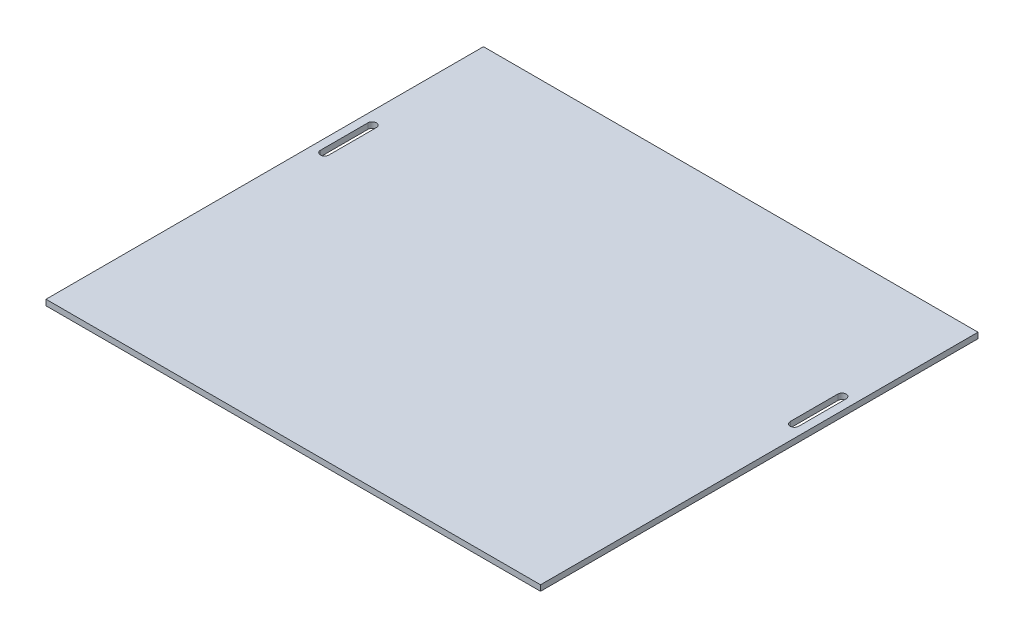
ISO-10303-21;
HEADER;
FILE_DESCRIPTION(('STEP AP214'),'2;1');
FILE_NAME('part.step','',(''),(''),'','','');
FILE_SCHEMA(('AUTOMOTIVE_DESIGN { 1 0 10303 214 1 1 1 1 }'));
ENDSEC;
DATA;
#1=APPLICATION_CONTEXT('core data for automotive mechanical design processes');
#2=APPLICATION_PROTOCOL_DEFINITION('international standard','automotive_design',2000,#1);
#3=PRODUCT_CONTEXT('',#1,'mechanical');
#4=PRODUCT('Part','Part','',(#3));
#5=PRODUCT_RELATED_PRODUCT_CATEGORY('part','',(#4));
#6=PRODUCT_DEFINITION_FORMATION('','',#4);
#7=PRODUCT_DEFINITION_CONTEXT('part definition',#1,'design');
#8=PRODUCT_DEFINITION('design','',#6,#7);
#9=PRODUCT_DEFINITION_SHAPE('','',#8);
#10=(LENGTH_UNIT() NAMED_UNIT(*) SI_UNIT(.MILLI.,.METRE.));
#11=(NAMED_UNIT(*) PLANE_ANGLE_UNIT() SI_UNIT($,.RADIAN.));
#12=(NAMED_UNIT(*) SI_UNIT($,.STERADIAN.) SOLID_ANGLE_UNIT());
#13=UNCERTAINTY_MEASURE_WITH_UNIT(LENGTH_MEASURE(1.E-05),#10,'distance_accuracy_value','');
#14=(GEOMETRIC_REPRESENTATION_CONTEXT(3) GLOBAL_UNCERTAINTY_ASSIGNED_CONTEXT((#13)) GLOBAL_UNIT_ASSIGNED_CONTEXT((#10,
#11,#12)) REPRESENTATION_CONTEXT('',''));
#15=CARTESIAN_POINT('',(0.,0.,0.));
#16=DIRECTION('',(0.,0.,1.));
#17=DIRECTION('',(1.,0.,0.));
#18=AXIS2_PLACEMENT_3D('',#15,#16,#17);
#19=CARTESIAN_POINT('',(260.,3.,0.));
#20=DIRECTION('',(0.,0.,1.));
#21=DIRECTION('',(1.,0.,0.));
#22=AXIS2_PLACEMENT_3D('',#19,#20,#21);
#23=PLANE('',#22);
#24=DIRECTION('',(-1.,0.,0.));
#25=VECTOR('',#24,1.);
#26=CARTESIAN_POINT('',(260.,0.,0.));
#27=LINE('',#26,#25);
#28=CARTESIAN_POINT('',(260.,0.,0.));
#29=VERTEX_POINT('',#28);
#30=CARTESIAN_POINT('',(0.,0.,0.));
#31=VERTEX_POINT('',#30);
#32=EDGE_CURVE('E164',#29,#31,#27,.T.);
#33=ORIENTED_EDGE('',*,*,#32,.T.);
#34=DIRECTION('',(0.,-1.,0.));
#35=VECTOR('',#34,1.);
#36=CARTESIAN_POINT('',(0.,3.,0.));
#37=LINE('',#36,#35);
#38=CARTESIAN_POINT('',(0.,3.,0.));
#39=VERTEX_POINT('',#38);
#40=EDGE_CURVE('E11',#39,#31,#37,.T.);
#41=ORIENTED_EDGE('',*,*,#40,.F.);
#42=DIRECTION('',(-1.,0.,0.));
#43=VECTOR('',#42,1.);
#44=CARTESIAN_POINT('',(260.,3.,0.));
#45=LINE('',#44,#43);
#46=CARTESIAN_POINT('',(260.,3.,0.));
#47=VERTEX_POINT('',#46);
#48=EDGE_CURVE('E197',#47,#39,#45,.T.);
#49=ORIENTED_EDGE('',*,*,#48,.F.);
#50=DIRECTION('',(0.,-1.,0.));
#51=VECTOR('',#50,1.);
#52=CARTESIAN_POINT('',(260.,3.,0.));
#53=LINE('',#52,#51);
#54=EDGE_CURVE('E207',#47,#29,#53,.T.);
#55=ORIENTED_EDGE('',*,*,#54,.T.);
#56=EDGE_LOOP('',(#33,#41,#49,#55));
#57=FACE_BOUND('',#56,.T.);
#58=ADVANCED_FACE('F39',(#57),#23,.F.);
#59=CARTESIAN_POINT('',(0.,3.,0.));
#60=DIRECTION('',(1.,0.,0.));
#61=DIRECTION('',(0.,0.,-1.));
#62=AXIS2_PLACEMENT_3D('',#59,#60,#61);
#63=PLANE('',#62);
#64=DIRECTION('',(0.,0.,1.));
#65=VECTOR('',#64,1.);
#66=CARTESIAN_POINT('',(0.,0.,0.));
#67=LINE('',#66,#65);
#68=CARTESIAN_POINT('',(0.,0.,230.));
#69=VERTEX_POINT('',#68);
#70=EDGE_CURVE('E210',#31,#69,#67,.T.);
#71=ORIENTED_EDGE('',*,*,#70,.T.);
#72=DIRECTION('',(0.,-1.,0.));
#73=VECTOR('',#72,1.);
#74=CARTESIAN_POINT('',(0.,3.,230.));
#75=LINE('',#74,#73);
#76=CARTESIAN_POINT('',(0.,3.,230.));
#77=VERTEX_POINT('',#76);
#78=EDGE_CURVE('E46',#77,#69,#75,.T.);
#79=ORIENTED_EDGE('',*,*,#78,.F.);
#80=DIRECTION('',(0.,0.,1.));
#81=VECTOR('',#80,1.);
#82=CARTESIAN_POINT('',(0.,3.,0.));
#83=LINE('',#82,#81);
#84=EDGE_CURVE('E200',#39,#77,#83,.T.);
#85=ORIENTED_EDGE('',*,*,#84,.F.);
#86=ORIENTED_EDGE('',*,*,#40,.T.);
#87=EDGE_LOOP('',(#71,#79,#85,#86));
#88=FACE_BOUND('',#87,.T.);
#89=ADVANCED_FACE('F239',(#88),#63,.F.);
#90=CARTESIAN_POINT('',(0.,3.,230.));
#91=DIRECTION('',(0.,0.,-1.));
#92=DIRECTION('',(-1.,0.,0.));
#93=AXIS2_PLACEMENT_3D('',#90,#91,#92);
#94=PLANE('',#93);
#95=DIRECTION('',(1.,0.,0.));
#96=VECTOR('',#95,1.);
#97=CARTESIAN_POINT('',(0.,0.,230.));
#98=LINE('',#97,#96);
#99=CARTESIAN_POINT('',(260.,0.,230.));
#100=VERTEX_POINT('',#99);
#101=EDGE_CURVE('E212',#69,#100,#98,.T.);
#102=ORIENTED_EDGE('',*,*,#101,.T.);
#103=DIRECTION('',(0.,-1.,0.));
#104=VECTOR('',#103,1.);
#105=CARTESIAN_POINT('',(260.,3.,230.));
#106=LINE('',#105,#104);
#107=CARTESIAN_POINT('',(260.,3.,230.));
#108=VERTEX_POINT('',#107);
#109=EDGE_CURVE('E217',#108,#100,#106,.T.);
#110=ORIENTED_EDGE('',*,*,#109,.F.);
#111=DIRECTION('',(1.,0.,0.));
#112=VECTOR('',#111,1.);
#113=CARTESIAN_POINT('',(0.,3.,230.));
#114=LINE('',#113,#112);
#115=EDGE_CURVE('E203',#77,#108,#114,.T.);
#116=ORIENTED_EDGE('',*,*,#115,.F.);
#117=ORIENTED_EDGE('',*,*,#78,.T.);
#118=EDGE_LOOP('',(#102,#110,#116,#117));
#119=FACE_BOUND('',#118,.T.);
#120=ADVANCED_FACE('F224',(#119),#94,.F.);
#121=CARTESIAN_POINT('',(260.,3.,230.));
#122=DIRECTION('',(-1.,0.,0.));
#123=DIRECTION('',(0.,0.,1.));
#124=AXIS2_PLACEMENT_3D('',#121,#122,#123);
#125=PLANE('',#124);
#126=DIRECTION('',(0.,0.,-1.));
#127=VECTOR('',#126,1.);
#128=CARTESIAN_POINT('',(260.,0.,230.));
#129=LINE('',#128,#127);
#130=EDGE_CURVE('E201',#100,#29,#129,.T.);
#131=ORIENTED_EDGE('',*,*,#130,.T.);
#132=ORIENTED_EDGE('',*,*,#54,.F.);
#133=DIRECTION('',(0.,0.,-1.));
#134=VECTOR('',#133,1.);
#135=CARTESIAN_POINT('',(260.,3.,230.));
#136=LINE('',#135,#134);
#137=EDGE_CURVE('E205',#108,#47,#136,.T.);
#138=ORIENTED_EDGE('',*,*,#137,.F.);
#139=ORIENTED_EDGE('',*,*,#109,.T.);
#140=EDGE_LOOP('',(#131,#132,#138,#139));
#141=FACE_BOUND('',#140,.T.);
#142=ADVANCED_FACE('F232',(#141),#125,.F.);
#143=CARTESIAN_POINT('',(0.,3.,0.));
#144=DIRECTION('',(0.,1.,0.));
#145=DIRECTION('',(0.,0.,1.));
#146=AXIS2_PLACEMENT_3D('',#143,#144,#145);
#147=PLANE('',#146);
#148=CARTESIAN_POINT('',(6.5,3.,65.));
#149=DIRECTION('',(0.,1.,0.));
#150=DIRECTION('',(0.,0.,1.));
#151=AXIS2_PLACEMENT_3D('',#148,#149,#150);
#152=CIRCLE('',#151,2.2);
#153=CARTESIAN_POINT('',(8.70000000000001,3.,65.));
#154=VERTEX_POINT('',#153);
#155=CARTESIAN_POINT('',(4.30000000000001,3.,65.));
#156=VERTEX_POINT('',#155);
#157=EDGE_CURVE('E53',#154,#156,#152,.T.);
#158=ORIENTED_EDGE('',*,*,#157,.F.);
#159=DIRECTION('',(0.,0.,-1.));
#160=VECTOR('',#159,1.);
#161=CARTESIAN_POINT('',(8.70000000000001,3.,65.));
#162=LINE('',#161,#160);
#163=CARTESIAN_POINT('',(8.70000000000001,3.,90.));
#164=VERTEX_POINT('',#163);
#165=EDGE_CURVE('E148',#164,#154,#162,.T.);
#166=ORIENTED_EDGE('',*,*,#165,.F.);
#167=CARTESIAN_POINT('',(6.5,3.,90.));
#168=DIRECTION('',(0.,1.,0.));
#169=DIRECTION('',(0.,0.,1.));
#170=AXIS2_PLACEMENT_3D('',#167,#168,#169);
#171=CIRCLE('',#170,2.2);
#172=CARTESIAN_POINT('',(4.3,3.,90.));
#173=VERTEX_POINT('',#172);
#174=EDGE_CURVE('E151',#173,#164,#171,.T.);
#175=ORIENTED_EDGE('',*,*,#174,.F.);
#176=DIRECTION('',(0.,0.,1.));
#177=VECTOR('',#176,1.);
#178=CARTESIAN_POINT('',(4.30000000000001,3.,65.));
#179=LINE('',#178,#177);
#180=EDGE_CURVE('E157',#156,#173,#179,.T.);
#181=ORIENTED_EDGE('',*,*,#180,.F.);
#182=EDGE_LOOP('',(#158,#166,#175,#181));
#183=FACE_BOUND('',#182,.T.);
#184=CARTESIAN_POINT('',(253.5,3.,65.));
#185=DIRECTION('',(0.,1.,0.));
#186=DIRECTION('',(0.,0.,-1.));
#187=AXIS2_PLACEMENT_3D('',#184,#185,#186);
#188=CIRCLE('',#187,2.20000000000004);
#189=CARTESIAN_POINT('',(255.7,3.,65.));
#190=VERTEX_POINT('',#189);
#191=CARTESIAN_POINT('',(251.3,3.,65.));
#192=VERTEX_POINT('',#191);
#193=EDGE_CURVE('E61',#190,#192,#188,.T.);
#194=ORIENTED_EDGE('',*,*,#193,.F.);
#195=DIRECTION('',(0.,0.,-1.));
#196=VECTOR('',#195,1.);
#197=CARTESIAN_POINT('',(255.7,3.,65.));
#198=LINE('',#197,#196);
#199=CARTESIAN_POINT('',(255.7,3.,90.));
#200=VERTEX_POINT('',#199);
#201=EDGE_CURVE('E172',#200,#190,#198,.T.);
#202=ORIENTED_EDGE('',*,*,#201,.F.);
#203=CARTESIAN_POINT('',(253.5,3.,90.));
#204=DIRECTION('',(0.,1.,0.));
#205=DIRECTION('',(0.,0.,-1.));
#206=AXIS2_PLACEMENT_3D('',#203,#204,#205);
#207=CIRCLE('',#206,2.20000000000004);
#208=CARTESIAN_POINT('',(251.3,3.,90.));
#209=VERTEX_POINT('',#208);
#210=EDGE_CURVE('E186',#209,#200,#207,.T.);
#211=ORIENTED_EDGE('',*,*,#210,.F.);
#212=DIRECTION('',(0.,0.,1.));
#213=VECTOR('',#212,1.);
#214=CARTESIAN_POINT('',(251.3,3.,65.));
#215=LINE('',#214,#213);
#216=EDGE_CURVE('E183',#192,#209,#215,.T.);
#217=ORIENTED_EDGE('',*,*,#216,.F.);
#218=EDGE_LOOP('',(#194,#202,#211,#217));
#219=FACE_BOUND('',#218,.T.);
#220=ORIENTED_EDGE('',*,*,#48,.T.);
#221=ORIENTED_EDGE('',*,*,#84,.T.);
#222=ORIENTED_EDGE('',*,*,#115,.T.);
#223=ORIENTED_EDGE('',*,*,#137,.T.);
#224=EDGE_LOOP('',(#220,#221,#222,#223));
#225=FACE_BOUND('',#224,.T.);
#226=ADVANCED_FACE('F238',(#183,#219,#225),#147,.T.);
#227=CARTESIAN_POINT('',(0.,0.,0.));
#228=DIRECTION('',(0.,1.,0.));
#229=DIRECTION('',(0.,0.,1.));
#230=AXIS2_PLACEMENT_3D('',#227,#228,#229);
#231=PLANE('',#230);
#232=DIRECTION('',(0.,0.,-1.));
#233=VECTOR('',#232,1.);
#234=CARTESIAN_POINT('',(8.70000000000001,0.,65.));
#235=LINE('',#234,#233);
#236=CARTESIAN_POINT('',(8.70000000000001,0.,90.));
#237=VERTEX_POINT('',#236);
#238=CARTESIAN_POINT('',(8.70000000000001,0.,65.));
#239=VERTEX_POINT('',#238);
#240=EDGE_CURVE('E135',#237,#239,#235,.T.);
#241=ORIENTED_EDGE('',*,*,#240,.T.);
#242=CARTESIAN_POINT('',(6.5,0.,65.));
#243=DIRECTION('',(0.,1.,0.));
#244=DIRECTION('',(0.,0.,1.));
#245=AXIS2_PLACEMENT_3D('',#242,#243,#244);
#246=CIRCLE('',#245,2.2);
#247=CARTESIAN_POINT('',(4.30000000000001,0.,65.));
#248=VERTEX_POINT('',#247);
#249=EDGE_CURVE('E129',#239,#248,#246,.T.);
#250=ORIENTED_EDGE('',*,*,#249,.T.);
#251=DIRECTION('',(0.,0.,1.));
#252=VECTOR('',#251,1.);
#253=CARTESIAN_POINT('',(4.30000000000001,0.,65.));
#254=LINE('',#253,#252);
#255=CARTESIAN_POINT('',(4.30000000000001,0.,90.));
#256=VERTEX_POINT('',#255);
#257=EDGE_CURVE('E139',#248,#256,#254,.T.);
#258=ORIENTED_EDGE('',*,*,#257,.T.);
#259=CARTESIAN_POINT('',(6.5,0.,90.));
#260=DIRECTION('',(0.,1.,0.));
#261=DIRECTION('',(0.,0.,1.));
#262=AXIS2_PLACEMENT_3D('',#259,#260,#261);
#263=CIRCLE('',#262,2.2);
#264=EDGE_CURVE('E143',#256,#237,#263,.T.);
#265=ORIENTED_EDGE('',*,*,#264,.T.);
#266=EDGE_LOOP('',(#241,#250,#258,#265));
#267=FACE_BOUND('',#266,.T.);
#268=DIRECTION('',(0.,0.,-1.));
#269=VECTOR('',#268,1.);
#270=CARTESIAN_POINT('',(255.7,0.,65.));
#271=LINE('',#270,#269);
#272=CARTESIAN_POINT('',(255.7,0.,90.));
#273=VERTEX_POINT('',#272);
#274=CARTESIAN_POINT('',(255.7,0.,65.));
#275=VERTEX_POINT('',#274);
#276=EDGE_CURVE('E178',#273,#275,#271,.T.);
#277=ORIENTED_EDGE('',*,*,#276,.T.);
#278=CARTESIAN_POINT('',(253.5,0.,65.));
#279=DIRECTION('',(0.,1.,0.));
#280=DIRECTION('',(0.,0.,-1.));
#281=AXIS2_PLACEMENT_3D('',#278,#279,#280);
#282=CIRCLE('',#281,2.20000000000004);
#283=CARTESIAN_POINT('',(251.3,0.,65.));
#284=VERTEX_POINT('',#283);
#285=EDGE_CURVE('E168',#275,#284,#282,.T.);
#286=ORIENTED_EDGE('',*,*,#285,.T.);
#287=DIRECTION('',(0.,0.,1.));
#288=VECTOR('',#287,1.);
#289=CARTESIAN_POINT('',(251.3,0.,65.));
#290=LINE('',#289,#288);
#291=CARTESIAN_POINT('',(251.3,0.,90.));
#292=VERTEX_POINT('',#291);
#293=EDGE_CURVE('E171',#284,#292,#290,.T.);
#294=ORIENTED_EDGE('',*,*,#293,.T.);
#295=CARTESIAN_POINT('',(253.5,0.,90.));
#296=DIRECTION('',(0.,1.,0.));
#297=DIRECTION('',(0.,0.,-1.));
#298=AXIS2_PLACEMENT_3D('',#295,#296,#297);
#299=CIRCLE('',#298,2.20000000000004);
#300=EDGE_CURVE('E175',#292,#273,#299,.T.);
#301=ORIENTED_EDGE('',*,*,#300,.T.);
#302=EDGE_LOOP('',(#277,#286,#294,#301));
#303=FACE_BOUND('',#302,.T.);
#304=ORIENTED_EDGE('',*,*,#32,.F.);
#305=ORIENTED_EDGE('',*,*,#130,.F.);
#306=ORIENTED_EDGE('',*,*,#101,.F.);
#307=ORIENTED_EDGE('',*,*,#70,.F.);
#308=EDGE_LOOP('',(#304,#305,#306,#307));
#309=FACE_BOUND('',#308,.T.);
#310=ADVANCED_FACE('F145',(#267,#303,#309),#231,.F.);
#311=CARTESIAN_POINT('',(253.5,0.,65.));
#312=DIRECTION('',(0.,1.,0.));
#313=DIRECTION('',(0.,0.,1.));
#314=AXIS2_PLACEMENT_3D('',#311,#312,#313);
#315=CYLINDRICAL_SURFACE('',#314,2.20000000000004);
#316=ORIENTED_EDGE('',*,*,#193,.T.);
#317=DIRECTION('',(0.,1.,0.));
#318=VECTOR('',#317,1.);
#319=CARTESIAN_POINT('',(251.3,0.,65.));
#320=LINE('',#319,#318);
#321=EDGE_CURVE('E181',#284,#192,#320,.T.);
#322=ORIENTED_EDGE('',*,*,#321,.F.);
#323=ORIENTED_EDGE('',*,*,#285,.F.);
#324=DIRECTION('',(0.,1.,0.));
#325=VECTOR('',#324,1.);
#326=CARTESIAN_POINT('',(255.7,0.,65.));
#327=LINE('',#326,#325);
#328=EDGE_CURVE('E158',#275,#190,#327,.T.);
#329=ORIENTED_EDGE('',*,*,#328,.T.);
#330=EDGE_LOOP('',(#316,#322,#323,#329));
#331=FACE_BOUND('',#330,.T.);
#332=ADVANCED_FACE('F251',(#331),#315,.F.);
#333=CARTESIAN_POINT('',(255.7,0.,65.));
#334=DIRECTION('',(1.,0.,0.));
#335=DIRECTION('',(0.,0.,-1.));
#336=AXIS2_PLACEMENT_3D('',#333,#334,#335);
#337=PLANE('',#336);
#338=ORIENTED_EDGE('',*,*,#201,.T.);
#339=ORIENTED_EDGE('',*,*,#328,.F.);
#340=ORIENTED_EDGE('',*,*,#276,.F.);
#341=DIRECTION('',(0.,1.,0.));
#342=VECTOR('',#341,1.);
#343=CARTESIAN_POINT('',(255.7,0.,90.));
#344=LINE('',#343,#342);
#345=EDGE_CURVE('E192',#273,#200,#344,.T.);
#346=ORIENTED_EDGE('',*,*,#345,.T.);
#347=EDGE_LOOP('',(#338,#339,#340,#346));
#348=FACE_BOUND('',#347,.T.);
#349=ADVANCED_FACE('F257',(#348),#337,.F.);
#350=CARTESIAN_POINT('',(253.5,0.,90.));
#351=DIRECTION('',(0.,1.,0.));
#352=DIRECTION('',(0.,0.,1.));
#353=AXIS2_PLACEMENT_3D('',#350,#351,#352);
#354=CYLINDRICAL_SURFACE('',#353,2.20000000000004);
#355=ORIENTED_EDGE('',*,*,#210,.T.);
#356=ORIENTED_EDGE('',*,*,#345,.F.);
#357=ORIENTED_EDGE('',*,*,#300,.F.);
#358=DIRECTION('',(0.,1.,0.));
#359=VECTOR('',#358,1.);
#360=CARTESIAN_POINT('',(251.3,0.,90.));
#361=LINE('',#360,#359);
#362=EDGE_CURVE('E194',#292,#209,#361,.T.);
#363=ORIENTED_EDGE('',*,*,#362,.T.);
#364=EDGE_LOOP('',(#355,#356,#357,#363));
#365=FACE_BOUND('',#364,.T.);
#366=ADVANCED_FACE('F261',(#365),#354,.F.);
#367=CARTESIAN_POINT('',(251.3,0.,65.));
#368=DIRECTION('',(-1.,0.,0.));
#369=DIRECTION('',(0.,0.,1.));
#370=AXIS2_PLACEMENT_3D('',#367,#368,#369);
#371=PLANE('',#370);
#372=ORIENTED_EDGE('',*,*,#216,.T.);
#373=ORIENTED_EDGE('',*,*,#362,.F.);
#374=ORIENTED_EDGE('',*,*,#293,.F.);
#375=ORIENTED_EDGE('',*,*,#321,.T.);
#376=EDGE_LOOP('',(#372,#373,#374,#375));
#377=FACE_BOUND('',#376,.T.);
#378=ADVANCED_FACE('F258',(#377),#371,.F.);
#379=CARTESIAN_POINT('',(6.5,0.,65.));
#380=DIRECTION('',(0.,1.,0.));
#381=DIRECTION('',(0.,0.,1.));
#382=AXIS2_PLACEMENT_3D('',#379,#380,#381);
#383=CYLINDRICAL_SURFACE('',#382,2.2);
#384=ORIENTED_EDGE('',*,*,#157,.T.);
#385=DIRECTION('',(0.,1.,0.));
#386=VECTOR('',#385,1.);
#387=CARTESIAN_POINT('',(4.30000000000001,0.,65.));
#388=LINE('',#387,#386);
#389=EDGE_CURVE('E125',#248,#156,#388,.T.);
#390=ORIENTED_EDGE('',*,*,#389,.F.);
#391=ORIENTED_EDGE('',*,*,#249,.F.);
#392=DIRECTION('',(0.,1.,0.));
#393=VECTOR('',#392,1.);
#394=CARTESIAN_POINT('',(8.70000000000001,0.,65.));
#395=LINE('',#394,#393);
#396=EDGE_CURVE('E162',#239,#154,#395,.T.);
#397=ORIENTED_EDGE('',*,*,#396,.T.);
#398=EDGE_LOOP('',(#384,#390,#391,#397));
#399=FACE_BOUND('',#398,.T.);
#400=ADVANCED_FACE('F127',(#399),#383,.F.);
#401=CARTESIAN_POINT('',(8.70000000000001,0.,65.));
#402=DIRECTION('',(1.,0.,0.));
#403=DIRECTION('',(0.,0.,-1.));
#404=AXIS2_PLACEMENT_3D('',#401,#402,#403);
#405=PLANE('',#404);
#406=ORIENTED_EDGE('',*,*,#165,.T.);
#407=ORIENTED_EDGE('',*,*,#396,.F.);
#408=ORIENTED_EDGE('',*,*,#240,.F.);
#409=DIRECTION('',(0.,1.,0.));
#410=VECTOR('',#409,1.);
#411=CARTESIAN_POINT('',(8.70000000000001,0.,90.));
#412=LINE('',#411,#410);
#413=EDGE_CURVE('E165',#237,#164,#412,.T.);
#414=ORIENTED_EDGE('',*,*,#413,.T.);
#415=EDGE_LOOP('',(#406,#407,#408,#414));
#416=FACE_BOUND('',#415,.T.);
#417=ADVANCED_FACE('F271',(#416),#405,.F.);
#418=CARTESIAN_POINT('',(6.5,0.,90.));
#419=DIRECTION('',(0.,1.,0.));
#420=DIRECTION('',(0.,0.,1.));
#421=AXIS2_PLACEMENT_3D('',#418,#419,#420);
#422=CYLINDRICAL_SURFACE('',#421,2.2);
#423=ORIENTED_EDGE('',*,*,#174,.T.);
#424=ORIENTED_EDGE('',*,*,#413,.F.);
#425=ORIENTED_EDGE('',*,*,#264,.F.);
#426=DIRECTION('',(0.,1.,0.));
#427=VECTOR('',#426,1.);
#428=CARTESIAN_POINT('',(4.3,0.,90.));
#429=LINE('',#428,#427);
#430=EDGE_CURVE('E134',#256,#173,#429,.T.);
#431=ORIENTED_EDGE('',*,*,#430,.T.);
#432=EDGE_LOOP('',(#423,#424,#425,#431));
#433=FACE_BOUND('',#432,.T.);
#434=ADVANCED_FACE('F274',(#433),#422,.F.);
#435=CARTESIAN_POINT('',(4.30000000000001,0.,65.));
#436=DIRECTION('',(-1.,0.,0.));
#437=DIRECTION('',(0.,0.,1.));
#438=AXIS2_PLACEMENT_3D('',#435,#436,#437);
#439=PLANE('',#438);
#440=ORIENTED_EDGE('',*,*,#180,.T.);
#441=ORIENTED_EDGE('',*,*,#430,.F.);
#442=ORIENTED_EDGE('',*,*,#257,.F.);
#443=ORIENTED_EDGE('',*,*,#389,.T.);
#444=EDGE_LOOP('',(#440,#441,#442,#443));
#445=FACE_BOUND('',#444,.T.);
#446=ADVANCED_FACE('F140',(#445),#439,.F.);
#447=CLOSED_SHELL('',(#58,#89,#120,#142,#226,#310,#332,#349,#366,#378,#400,#417,#434,#446));
#448=MANIFOLD_SOLID_BREP('B2',#447);
#449=ADVANCED_BREP_SHAPE_REPRESENTATION('',(#18,#448),#14);
#450=SHAPE_DEFINITION_REPRESENTATION(#9,#449);
ENDSEC;
END-ISO-10303-21;
